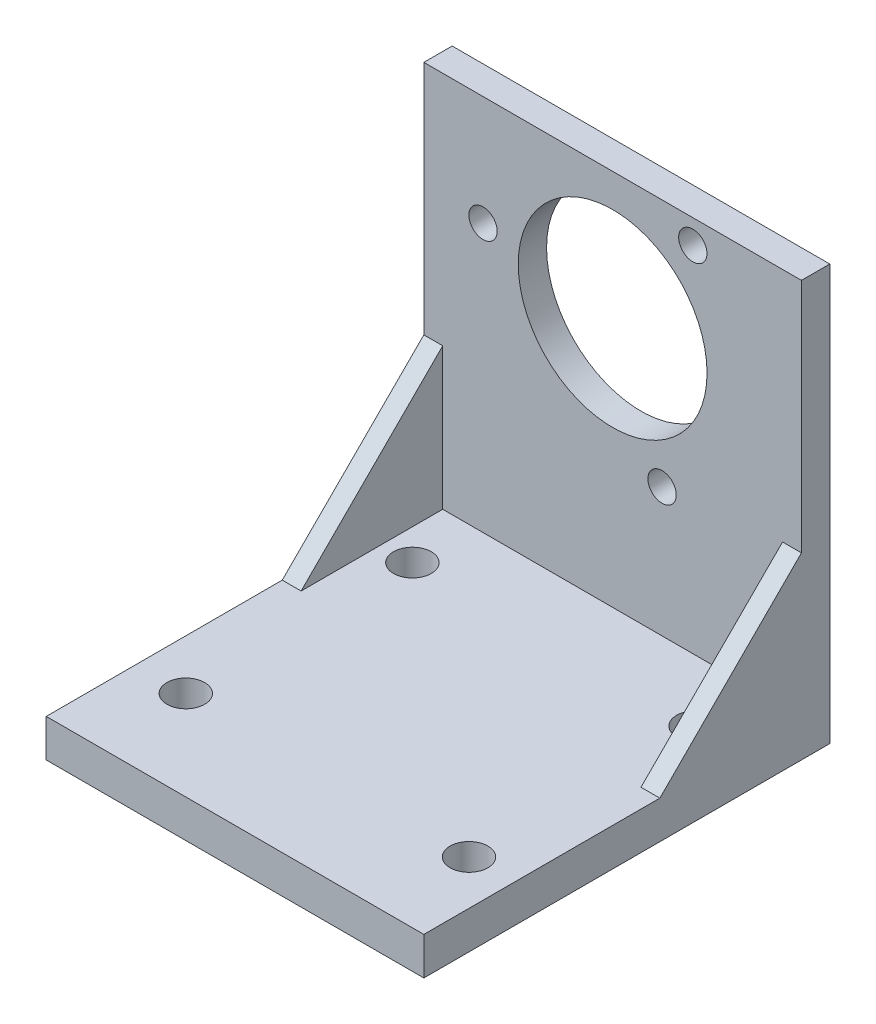
ISO-10303-21;
HEADER;
FILE_DESCRIPTION(('STEP AP214'),'2;1');
FILE_NAME('part.step','',(''),(''),'','','');
FILE_SCHEMA(('AUTOMOTIVE_DESIGN { 1 0 10303 214 1 1 1 1 }'));
ENDSEC;
DATA;
#1=APPLICATION_CONTEXT('core data for automotive mechanical design processes');
#2=APPLICATION_PROTOCOL_DEFINITION('international standard','automotive_design',2000,#1);
#3=PRODUCT_CONTEXT('',#1,'mechanical');
#4=PRODUCT('Part','Part','',(#3));
#5=PRODUCT_RELATED_PRODUCT_CATEGORY('part','',(#4));
#6=PRODUCT_DEFINITION_FORMATION('','',#4);
#7=PRODUCT_DEFINITION_CONTEXT('part definition',#1,'design');
#8=PRODUCT_DEFINITION('design','',#6,#7);
#9=PRODUCT_DEFINITION_SHAPE('','',#8);
#10=(LENGTH_UNIT() NAMED_UNIT(*) SI_UNIT(.MILLI.,.METRE.));
#11=(NAMED_UNIT(*) PLANE_ANGLE_UNIT() SI_UNIT($,.RADIAN.));
#12=(NAMED_UNIT(*) SI_UNIT($,.STERADIAN.) SOLID_ANGLE_UNIT());
#13=UNCERTAINTY_MEASURE_WITH_UNIT(LENGTH_MEASURE(1.E-05),#10,'distance_accuracy_value','');
#14=(GEOMETRIC_REPRESENTATION_CONTEXT(3) GLOBAL_UNCERTAINTY_ASSIGNED_CONTEXT((#13)) GLOBAL_UNIT_ASSIGNED_CONTEXT((#10,
#11,#12)) REPRESENTATION_CONTEXT('',''));
#15=CARTESIAN_POINT('',(0.,0.,0.));
#16=DIRECTION('',(0.,0.,1.));
#17=DIRECTION('',(1.,0.,0.));
#18=AXIS2_PLACEMENT_3D('',#15,#16,#17);
#19=CARTESIAN_POINT('',(0.,-4.,21.5));
#20=DIRECTION('',(0.,0.,1.));
#21=DIRECTION('',(1.,0.,0.));
#22=AXIS2_PLACEMENT_3D('',#19,#20,#21);
#23=PLANE('',#22);
#24=DIRECTION('',(1.,0.,0.));
#25=VECTOR('',#24,1.);
#26=CARTESIAN_POINT('',(0.,0.,21.5));
#27=LINE('',#26,#25);
#28=CARTESIAN_POINT('',(-20.,0.,21.5));
#29=VERTEX_POINT('',#28);
#30=CARTESIAN_POINT('',(20.,0.,21.5));
#31=VERTEX_POINT('',#30);
#32=EDGE_CURVE('E234',#29,#31,#27,.T.);
#33=ORIENTED_EDGE('',*,*,#32,.F.);
#34=DIRECTION('',(0.,1.,0.));
#35=VECTOR('',#34,1.);
#36=CARTESIAN_POINT('',(-20.,-4.,21.5));
#37=LINE('',#36,#35);
#38=CARTESIAN_POINT('',(-20.,-4.,21.5));
#39=VERTEX_POINT('',#38);
#40=EDGE_CURVE('E12',#39,#29,#37,.T.);
#41=ORIENTED_EDGE('',*,*,#40,.F.);
#42=DIRECTION('',(1.,0.,0.));
#43=VECTOR('',#42,1.);
#44=CARTESIAN_POINT('',(0.,-4.,21.5));
#45=LINE('',#44,#43);
#46=CARTESIAN_POINT('',(20.,-4.,21.5));
#47=VERTEX_POINT('',#46);
#48=EDGE_CURVE('E212',#39,#47,#45,.T.);
#49=ORIENTED_EDGE('',*,*,#48,.T.);
#50=DIRECTION('',(0.,1.,0.));
#51=VECTOR('',#50,1.);
#52=CARTESIAN_POINT('',(20.,-4.,21.5));
#53=LINE('',#52,#51);
#54=EDGE_CURVE('E54',#47,#31,#53,.T.);
#55=ORIENTED_EDGE('',*,*,#54,.T.);
#56=EDGE_LOOP('',(#33,#41,#49,#55));
#57=FACE_BOUND('',#56,.T.);
#58=ADVANCED_FACE('F50',(#57),#23,.T.);
#59=CARTESIAN_POINT('',(-20.,-4.,0.));
#60=DIRECTION('',(1.,0.,0.));
#61=DIRECTION('',(0.,0.,-1.));
#62=AXIS2_PLACEMENT_3D('',#59,#60,#61);
#63=PLANE('',#62);
#64=DIRECTION('',(0.,0.,-1.));
#65=VECTOR('',#64,1.);
#66=CARTESIAN_POINT('',(-20.,0.,0.));
#67=LINE('',#66,#65);
#68=CARTESIAN_POINT('',(-20.,0.,-3.5));
#69=VERTEX_POINT('',#68);
#70=EDGE_CURVE('E203',#29,#69,#67,.T.);
#71=ORIENTED_EDGE('',*,*,#70,.T.);
#72=DIRECTION('',(0.,0.707106781186547,-0.707106781186547));
#73=VECTOR('',#72,1.);
#74=CARTESIAN_POINT('',(-20.,15.,-18.5));
#75=LINE('',#74,#73);
#76=CARTESIAN_POINT('',(-20.,15.,-18.5));
#77=VERTEX_POINT('',#76);
#78=EDGE_CURVE('E258',#69,#77,#75,.T.);
#79=ORIENTED_EDGE('',*,*,#78,.T.);
#80=DIRECTION('',(0.,-1.,0.));
#81=VECTOR('',#80,1.);
#82=CARTESIAN_POINT('',(-20.,40.,-18.5));
#83=LINE('',#82,#81);
#84=CARTESIAN_POINT('',(-20.,40.,-18.5));
#85=VERTEX_POINT('',#84);
#86=EDGE_CURVE('E196',#85,#77,#83,.T.);
#87=ORIENTED_EDGE('',*,*,#86,.F.);
#88=DIRECTION('',(0.,0.,1.));
#89=VECTOR('',#88,1.);
#90=CARTESIAN_POINT('',(-20.,40.,0.));
#91=LINE('',#90,#89);
#92=CARTESIAN_POINT('',(-20.,40.,-21.5));
#93=VERTEX_POINT('',#92);
#94=EDGE_CURVE('E182',#93,#85,#91,.T.);
#95=ORIENTED_EDGE('',*,*,#94,.F.);
#96=DIRECTION('',(0.,1.,0.));
#97=VECTOR('',#96,1.);
#98=CARTESIAN_POINT('',(-20.,-4.,-21.5));
#99=LINE('',#98,#97);
#100=CARTESIAN_POINT('',(-20.,-4.,-21.5));
#101=VERTEX_POINT('',#100);
#102=EDGE_CURVE('E59',#101,#93,#99,.T.);
#103=ORIENTED_EDGE('',*,*,#102,.F.);
#104=DIRECTION('',(0.,0.,-1.));
#105=VECTOR('',#104,1.);
#106=CARTESIAN_POINT('',(-20.,-4.,0.));
#107=LINE('',#106,#105);
#108=EDGE_CURVE('E220',#39,#101,#107,.T.);
#109=ORIENTED_EDGE('',*,*,#108,.F.);
#110=ORIENTED_EDGE('',*,*,#40,.T.);
#111=EDGE_LOOP('',(#71,#79,#87,#95,#103,#109,#110));
#112=FACE_BOUND('',#111,.T.);
#113=ADVANCED_FACE('F256',(#112),#63,.F.);
#114=CARTESIAN_POINT('',(0.,-4.,-21.5));
#115=DIRECTION('',(0.,0.,1.));
#116=DIRECTION('',(1.,0.,0.));
#117=AXIS2_PLACEMENT_3D('',#114,#115,#116);
#118=PLANE('',#117);
#119=CARTESIAN_POINT('',(5.23636965743753,13.671109447397,-21.5));
#120=DIRECTION('',(0.,0.,1.));
#121=DIRECTION('',(1.,0.,0.));
#122=AXIS2_PLACEMENT_3D('',#119,#120,#121);
#123=CIRCLE('',#122,1.5);
#124=CARTESIAN_POINT('',(6.73636965743753,13.671109447397,-21.5));
#125=VERTEX_POINT('',#124);
#126=EDGE_CURVE('E179',#125,#125,#123,.T.);
#127=ORIENTED_EDGE('',*,*,#126,.T.);
#128=EDGE_LOOP('',(#127));
#129=FACE_BOUND('',#128,.T.);
#130=CARTESIAN_POINT('',(8.49196029220565,37.4492744232484,-21.5));
#131=DIRECTION('',(0.,0.,1.));
#132=DIRECTION('',(1.,0.,0.));
#133=AXIS2_PLACEMENT_3D('',#130,#131,#132);
#134=CIRCLE('',#133,1.5);
#135=CARTESIAN_POINT('',(9.99196029220565,37.4492744232484,-21.5));
#136=VERTEX_POINT('',#135);
#137=EDGE_CURVE('E176',#136,#136,#134,.T.);
#138=ORIENTED_EDGE('',*,*,#137,.T.);
#139=EDGE_LOOP('',(#138));
#140=FACE_BOUND('',#139,.T.);
#141=CARTESIAN_POINT('',(-13.7283299496432,28.3796161293546,-21.5));
#142=DIRECTION('',(0.,0.,1.));
#143=DIRECTION('',(1.,0.,0.));
#144=AXIS2_PLACEMENT_3D('',#141,#142,#143);
#145=CIRCLE('',#144,1.5);
#146=CARTESIAN_POINT('',(-12.2283299496432,28.3796161293546,-21.5));
#147=VERTEX_POINT('',#146);
#148=EDGE_CURVE('E173',#147,#147,#145,.T.);
#149=ORIENTED_EDGE('',*,*,#148,.T.);
#150=EDGE_LOOP('',(#149));
#151=FACE_BOUND('',#150,.T.);
#152=CARTESIAN_POINT('',(0.,26.5,-21.5));
#153=DIRECTION('',(0.,0.,1.));
#154=DIRECTION('',(1.,0.,0.));
#155=AXIS2_PLACEMENT_3D('',#152,#153,#154);
#156=CIRCLE('',#155,10.);
#157=CARTESIAN_POINT('',(10.,26.5,-21.5));
#158=VERTEX_POINT('',#157);
#159=EDGE_CURVE('E170',#158,#158,#156,.T.);
#160=ORIENTED_EDGE('',*,*,#159,.T.);
#161=EDGE_LOOP('',(#160));
#162=FACE_BOUND('',#161,.T.);
#163=ORIENTED_EDGE('',*,*,#102,.T.);
#164=DIRECTION('',(-1.,0.,0.));
#165=VECTOR('',#164,1.);
#166=CARTESIAN_POINT('',(0.,40.,-21.5));
#167=LINE('',#166,#165);
#168=CARTESIAN_POINT('',(20.,40.,-21.5));
#169=VERTEX_POINT('',#168);
#170=EDGE_CURVE('E190',#169,#93,#167,.T.);
#171=ORIENTED_EDGE('',*,*,#170,.F.);
#172=DIRECTION('',(0.,1.,0.));
#173=VECTOR('',#172,1.);
#174=CARTESIAN_POINT('',(20.,-4.,-21.5));
#175=LINE('',#174,#173);
#176=CARTESIAN_POINT('',(20.,-4.,-21.5));
#177=VERTEX_POINT('',#176);
#178=EDGE_CURVE('E241',#177,#169,#175,.T.);
#179=ORIENTED_EDGE('',*,*,#178,.F.);
#180=DIRECTION('',(1.,0.,0.));
#181=VECTOR('',#180,1.);
#182=CARTESIAN_POINT('',(0.,-4.,-21.5));
#183=LINE('',#182,#181);
#184=EDGE_CURVE('E218',#101,#177,#183,.T.);
#185=ORIENTED_EDGE('',*,*,#184,.F.);
#186=EDGE_LOOP('',(#163,#171,#179,#185));
#187=FACE_BOUND('',#186,.T.);
#188=ADVANCED_FACE('F280',(#129,#140,#151,#162,#187),#118,.F.);
#189=CARTESIAN_POINT('',(-14.7150530034863,-4.,-12.));
#190=DIRECTION('',(0.,1.,0.));
#191=DIRECTION('',(0.,0.,1.));
#192=AXIS2_PLACEMENT_3D('',#189,#190,#191);
#193=CYLINDRICAL_SURFACE('',#192,2.);
#194=CARTESIAN_POINT('',(-14.7150530034863,-4.,-12.));
#195=DIRECTION('',(0.,1.,0.));
#196=DIRECTION('',(0.,0.,1.));
#197=AXIS2_PLACEMENT_3D('',#194,#195,#196);
#198=CIRCLE('',#197,2.);
#199=CARTESIAN_POINT('',(-14.7150530034863,-4.,-10.));
#200=VERTEX_POINT('',#199);
#201=EDGE_CURVE('E209',#200,#200,#198,.T.);
#202=ORIENTED_EDGE('',*,*,#201,.F.);
#203=EDGE_LOOP('',(#202));
#204=FACE_BOUND('',#203,.T.);
#205=CARTESIAN_POINT('',(-14.7150530034863,0.,-12.));
#206=DIRECTION('',(0.,1.,0.));
#207=DIRECTION('',(0.,0.,1.));
#208=AXIS2_PLACEMENT_3D('',#205,#206,#207);
#209=CIRCLE('',#208,2.);
#210=CARTESIAN_POINT('',(-14.7150530034863,0.,-10.));
#211=VERTEX_POINT('',#210);
#212=EDGE_CURVE('E231',#211,#211,#209,.T.);
#213=ORIENTED_EDGE('',*,*,#212,.T.);
#214=EDGE_LOOP('',(#213));
#215=FACE_BOUND('',#214,.T.);
#216=ADVANCED_FACE('F302',(#204,#215),#193,.F.);
#217=CARTESIAN_POINT('',(15.2849469965137,-4.,-12.));
#218=DIRECTION('',(0.,1.,0.));
#219=DIRECTION('',(0.,0.,1.));
#220=AXIS2_PLACEMENT_3D('',#217,#218,#219);
#221=CYLINDRICAL_SURFACE('',#220,2.);
#222=CARTESIAN_POINT('',(15.2849469965137,-4.,-12.));
#223=DIRECTION('',(0.,1.,0.));
#224=DIRECTION('',(0.,0.,1.));
#225=AXIS2_PLACEMENT_3D('',#222,#223,#224);
#226=CIRCLE('',#225,2.);
#227=CARTESIAN_POINT('',(15.2849469965137,-4.,-9.99999999999999));
#228=VERTEX_POINT('',#227);
#229=EDGE_CURVE('E206',#228,#228,#226,.T.);
#230=ORIENTED_EDGE('',*,*,#229,.F.);
#231=EDGE_LOOP('',(#230));
#232=FACE_BOUND('',#231,.T.);
#233=CARTESIAN_POINT('',(15.2849469965137,0.,-12.));
#234=DIRECTION('',(0.,1.,0.));
#235=DIRECTION('',(0.,0.,1.));
#236=AXIS2_PLACEMENT_3D('',#233,#234,#235);
#237=CIRCLE('',#236,2.);
#238=CARTESIAN_POINT('',(15.2849469965137,0.,-9.99999999999999));
#239=VERTEX_POINT('',#238);
#240=EDGE_CURVE('E228',#239,#239,#237,.T.);
#241=ORIENTED_EDGE('',*,*,#240,.T.);
#242=EDGE_LOOP('',(#241));
#243=FACE_BOUND('',#242,.T.);
#244=ADVANCED_FACE('F305',(#232,#243),#221,.F.);
#245=CARTESIAN_POINT('',(-14.7150530034863,-4.,12.));
#246=DIRECTION('',(0.,1.,0.));
#247=DIRECTION('',(0.,0.,1.));
#248=AXIS2_PLACEMENT_3D('',#245,#246,#247);
#249=CYLINDRICAL_SURFACE('',#248,2.);
#250=CARTESIAN_POINT('',(-14.7150530034863,-4.,12.));
#251=DIRECTION('',(0.,1.,0.));
#252=DIRECTION('',(0.,0.,1.));
#253=AXIS2_PLACEMENT_3D('',#250,#251,#252);
#254=CIRCLE('',#253,2.);
#255=CARTESIAN_POINT('',(-14.7150530034863,-4.,14.));
#256=VERTEX_POINT('',#255);
#257=EDGE_CURVE('E202',#256,#256,#254,.T.);
#258=ORIENTED_EDGE('',*,*,#257,.F.);
#259=EDGE_LOOP('',(#258));
#260=FACE_BOUND('',#259,.T.);
#261=CARTESIAN_POINT('',(-14.7150530034863,0.,12.));
#262=DIRECTION('',(0.,1.,0.));
#263=DIRECTION('',(0.,0.,1.));
#264=AXIS2_PLACEMENT_3D('',#261,#262,#263);
#265=CIRCLE('',#264,2.);
#266=CARTESIAN_POINT('',(-14.7150530034863,0.,14.));
#267=VERTEX_POINT('',#266);
#268=EDGE_CURVE('E225',#267,#267,#265,.T.);
#269=ORIENTED_EDGE('',*,*,#268,.T.);
#270=EDGE_LOOP('',(#269));
#271=FACE_BOUND('',#270,.T.);
#272=ADVANCED_FACE('F308',(#260,#271),#249,.F.);
#273=CARTESIAN_POINT('',(15.2849469965137,-4.,12.));
#274=DIRECTION('',(0.,1.,0.));
#275=DIRECTION('',(0.,0.,1.));
#276=AXIS2_PLACEMENT_3D('',#273,#274,#275);
#277=CYLINDRICAL_SURFACE('',#276,2.);
#278=CARTESIAN_POINT('',(15.2849469965137,-4.,12.));
#279=DIRECTION('',(0.,1.,0.));
#280=DIRECTION('',(0.,0.,1.));
#281=AXIS2_PLACEMENT_3D('',#278,#279,#280);
#282=CIRCLE('',#281,2.);
#283=CARTESIAN_POINT('',(15.2849469965137,-4.,14.));
#284=VERTEX_POINT('',#283);
#285=EDGE_CURVE('E199',#284,#284,#282,.T.);
#286=ORIENTED_EDGE('',*,*,#285,.F.);
#287=EDGE_LOOP('',(#286));
#288=FACE_BOUND('',#287,.T.);
#289=CARTESIAN_POINT('',(15.2849469965137,0.,12.));
#290=DIRECTION('',(0.,1.,0.));
#291=DIRECTION('',(0.,0.,1.));
#292=AXIS2_PLACEMENT_3D('',#289,#290,#291);
#293=CIRCLE('',#292,2.);
#294=CARTESIAN_POINT('',(15.2849469965137,0.,14.));
#295=VERTEX_POINT('',#294);
#296=EDGE_CURVE('E198',#295,#295,#293,.T.);
#297=ORIENTED_EDGE('',*,*,#296,.T.);
#298=EDGE_LOOP('',(#297));
#299=FACE_BOUND('',#298,.T.);
#300=ADVANCED_FACE('F52',(#288,#299),#277,.F.);
#301=CARTESIAN_POINT('',(20.,-4.,0.));
#302=DIRECTION('',(1.,0.,0.));
#303=DIRECTION('',(0.,0.,-1.));
#304=AXIS2_PLACEMENT_3D('',#301,#302,#303);
#305=PLANE('',#304);
#306=DIRECTION('',(0.,0.,-1.));
#307=VECTOR('',#306,1.);
#308=CARTESIAN_POINT('',(20.,0.,0.));
#309=LINE('',#308,#307);
#310=CARTESIAN_POINT('',(20.,0.,-3.5));
#311=VERTEX_POINT('',#310);
#312=EDGE_CURVE('E237',#31,#311,#309,.T.);
#313=ORIENTED_EDGE('',*,*,#312,.F.);
#314=ORIENTED_EDGE('',*,*,#54,.F.);
#315=DIRECTION('',(0.,0.,-1.));
#316=VECTOR('',#315,1.);
#317=CARTESIAN_POINT('',(20.,-4.,0.));
#318=LINE('',#317,#316);
#319=EDGE_CURVE('E215',#47,#177,#318,.T.);
#320=ORIENTED_EDGE('',*,*,#319,.T.);
#321=ORIENTED_EDGE('',*,*,#178,.T.);
#322=DIRECTION('',(0.,0.,-1.));
#323=VECTOR('',#322,1.);
#324=CARTESIAN_POINT('',(20.,40.,0.));
#325=LINE('',#324,#323);
#326=CARTESIAN_POINT('',(20.,40.,-18.5));
#327=VERTEX_POINT('',#326);
#328=EDGE_CURVE('E187',#327,#169,#325,.T.);
#329=ORIENTED_EDGE('',*,*,#328,.F.);
#330=DIRECTION('',(0.,-1.,0.));
#331=VECTOR('',#330,1.);
#332=CARTESIAN_POINT('',(20.,40.,-18.5));
#333=LINE('',#332,#331);
#334=CARTESIAN_POINT('',(20.,15.,-18.5));
#335=VERTEX_POINT('',#334);
#336=EDGE_CURVE('E193',#327,#335,#333,.T.);
#337=ORIENTED_EDGE('',*,*,#336,.T.);
#338=DIRECTION('',(0.,-0.707106781186547,0.707106781186547));
#339=VECTOR('',#338,1.);
#340=CARTESIAN_POINT('',(20.,15.,-18.5));
#341=LINE('',#340,#339);
#342=EDGE_CURVE('E133',#335,#311,#341,.T.);
#343=ORIENTED_EDGE('',*,*,#342,.T.);
#344=EDGE_LOOP('',(#313,#314,#320,#321,#329,#337,#343));
#345=FACE_BOUND('',#344,.T.);
#346=ADVANCED_FACE('F250',(#345),#305,.T.);
#347=CARTESIAN_POINT('',(0.,-4.,0.));
#348=DIRECTION('',(0.,1.,0.));
#349=DIRECTION('',(0.,0.,1.));
#350=AXIS2_PLACEMENT_3D('',#347,#348,#349);
#351=PLANE('',#350);
#352=ORIENTED_EDGE('',*,*,#285,.T.);
#353=EDGE_LOOP('',(#352));
#354=FACE_BOUND('',#353,.T.);
#355=ORIENTED_EDGE('',*,*,#257,.T.);
#356=EDGE_LOOP('',(#355));
#357=FACE_BOUND('',#356,.T.);
#358=ORIENTED_EDGE('',*,*,#229,.T.);
#359=EDGE_LOOP('',(#358));
#360=FACE_BOUND('',#359,.T.);
#361=ORIENTED_EDGE('',*,*,#201,.T.);
#362=EDGE_LOOP('',(#361));
#363=FACE_BOUND('',#362,.T.);
#364=ORIENTED_EDGE('',*,*,#48,.F.);
#365=ORIENTED_EDGE('',*,*,#108,.T.);
#366=ORIENTED_EDGE('',*,*,#184,.T.);
#367=ORIENTED_EDGE('',*,*,#319,.F.);
#368=EDGE_LOOP('',(#364,#365,#366,#367));
#369=FACE_BOUND('',#368,.T.);
#370=ADVANCED_FACE('F282',(#354,#357,#360,#363,#369),#351,.F.);
#371=CARTESIAN_POINT('',(0.,0.,0.));
#372=DIRECTION('',(0.,1.,0.));
#373=DIRECTION('',(0.,0.,1.));
#374=AXIS2_PLACEMENT_3D('',#371,#372,#373);
#375=PLANE('',#374);
#376=DIRECTION('',(-1.,0.,0.));
#377=VECTOR('',#376,1.);
#378=CARTESIAN_POINT('',(-18.,0.,-3.5));
#379=LINE('',#378,#377);
#380=CARTESIAN_POINT('',(-18.,0.,-3.5));
#381=VERTEX_POINT('',#380);
#382=EDGE_CURVE('E71',#381,#69,#379,.T.);
#383=ORIENTED_EDGE('',*,*,#382,.T.);
#384=ORIENTED_EDGE('',*,*,#70,.F.);
#385=ORIENTED_EDGE('',*,*,#32,.T.);
#386=ORIENTED_EDGE('',*,*,#312,.T.);
#387=DIRECTION('',(1.,0.,0.));
#388=VECTOR('',#387,1.);
#389=CARTESIAN_POINT('',(18.,0.,-3.5));
#390=LINE('',#389,#388);
#391=CARTESIAN_POINT('',(18.,0.,-3.5));
#392=VERTEX_POINT('',#391);
#393=EDGE_CURVE('E138',#392,#311,#390,.T.);
#394=ORIENTED_EDGE('',*,*,#393,.F.);
#395=DIRECTION('',(0.,0.,-1.));
#396=VECTOR('',#395,1.);
#397=CARTESIAN_POINT('',(18.,0.,-3.5));
#398=LINE('',#397,#396);
#399=CARTESIAN_POINT('',(18.,0.,-18.5));
#400=VERTEX_POINT('',#399);
#401=EDGE_CURVE('E139',#392,#400,#398,.T.);
#402=ORIENTED_EDGE('',*,*,#401,.T.);
#403=DIRECTION('',(1.,0.,0.));
#404=VECTOR('',#403,1.);
#405=CARTESIAN_POINT('',(0.,0.,-18.5));
#406=LINE('',#405,#404);
#407=CARTESIAN_POINT('',(-18.,0.,-18.5));
#408=VERTEX_POINT('',#407);
#409=EDGE_CURVE('E149',#408,#400,#406,.T.);
#410=ORIENTED_EDGE('',*,*,#409,.F.);
#411=DIRECTION('',(0.,0.,1.));
#412=VECTOR('',#411,1.);
#413=CARTESIAN_POINT('',(-18.,0.,-3.5));
#414=LINE('',#413,#412);
#415=EDGE_CURVE('E67',#408,#381,#414,.T.);
#416=ORIENTED_EDGE('',*,*,#415,.T.);
#417=EDGE_LOOP('',(#383,#384,#385,#386,#394,#402,#410,#416));
#418=FACE_BOUND('',#417,.T.);
#419=ORIENTED_EDGE('',*,*,#296,.F.);
#420=EDGE_LOOP('',(#419));
#421=FACE_BOUND('',#420,.T.);
#422=ORIENTED_EDGE('',*,*,#268,.F.);
#423=EDGE_LOOP('',(#422));
#424=FACE_BOUND('',#423,.T.);
#425=ORIENTED_EDGE('',*,*,#240,.F.);
#426=EDGE_LOOP('',(#425));
#427=FACE_BOUND('',#426,.T.);
#428=ORIENTED_EDGE('',*,*,#212,.F.);
#429=EDGE_LOOP('',(#428));
#430=FACE_BOUND('',#429,.T.);
#431=ADVANCED_FACE('F251',(#418,#421,#424,#427,#430),#375,.T.);
#432=CARTESIAN_POINT('',(0.,40.,-18.5));
#433=DIRECTION('',(0.,0.,-1.));
#434=DIRECTION('',(-1.,0.,0.));
#435=AXIS2_PLACEMENT_3D('',#432,#433,#434);
#436=PLANE('',#435);
#437=CARTESIAN_POINT('',(5.23636965743753,13.671109447397,-18.5));
#438=DIRECTION('',(0.,0.,1.));
#439=DIRECTION('',(1.,0.,0.));
#440=AXIS2_PLACEMENT_3D('',#437,#438,#439);
#441=CIRCLE('',#440,1.5);
#442=CARTESIAN_POINT('',(6.73636965743753,13.671109447397,-18.5));
#443=VERTEX_POINT('',#442);
#444=EDGE_CURVE('E157',#443,#443,#441,.T.);
#445=ORIENTED_EDGE('',*,*,#444,.F.);
#446=EDGE_LOOP('',(#445));
#447=FACE_BOUND('',#446,.T.);
#448=CARTESIAN_POINT('',(8.49196029220565,37.4492744232484,-18.5));
#449=DIRECTION('',(0.,0.,1.));
#450=DIRECTION('',(1.,0.,0.));
#451=AXIS2_PLACEMENT_3D('',#448,#449,#450);
#452=CIRCLE('',#451,1.5);
#453=CARTESIAN_POINT('',(9.99196029220565,37.4492744232484,-18.5));
#454=VERTEX_POINT('',#453);
#455=EDGE_CURVE('E163',#454,#454,#452,.T.);
#456=ORIENTED_EDGE('',*,*,#455,.F.);
#457=EDGE_LOOP('',(#456));
#458=FACE_BOUND('',#457,.T.);
#459=CARTESIAN_POINT('',(-13.7283299496432,28.3796161293546,-18.5));
#460=DIRECTION('',(0.,0.,1.));
#461=DIRECTION('',(1.,0.,0.));
#462=AXIS2_PLACEMENT_3D('',#459,#460,#461);
#463=CIRCLE('',#462,1.5);
#464=CARTESIAN_POINT('',(-12.2283299496432,28.3796161293546,-18.5));
#465=VERTEX_POINT('',#464);
#466=EDGE_CURVE('E159',#465,#465,#463,.T.);
#467=ORIENTED_EDGE('',*,*,#466,.F.);
#468=EDGE_LOOP('',(#467));
#469=FACE_BOUND('',#468,.T.);
#470=CARTESIAN_POINT('',(0.,26.5,-18.5));
#471=DIRECTION('',(0.,0.,1.));
#472=DIRECTION('',(1.,0.,0.));
#473=AXIS2_PLACEMENT_3D('',#470,#471,#472);
#474=CIRCLE('',#473,10.);
#475=CARTESIAN_POINT('',(10.,26.5,-18.5));
#476=VERTEX_POINT('',#475);
#477=EDGE_CURVE('E162',#476,#476,#474,.T.);
#478=ORIENTED_EDGE('',*,*,#477,.F.);
#479=EDGE_LOOP('',(#478));
#480=FACE_BOUND('',#479,.T.);
#481=ORIENTED_EDGE('',*,*,#86,.T.);
#482=DIRECTION('',(-1.,0.,0.));
#483=VECTOR('',#482,1.);
#484=CARTESIAN_POINT('',(-18.,15.,-18.5));
#485=LINE('',#484,#483);
#486=CARTESIAN_POINT('',(-18.,15.,-18.5));
#487=VERTEX_POINT('',#486);
#488=EDGE_CURVE('E151',#487,#77,#485,.T.);
#489=ORIENTED_EDGE('',*,*,#488,.F.);
#490=DIRECTION('',(0.,-1.,0.));
#491=VECTOR('',#490,1.);
#492=CARTESIAN_POINT('',(-18.,0.,-18.5));
#493=LINE('',#492,#491);
#494=EDGE_CURVE('E265',#487,#408,#493,.T.);
#495=ORIENTED_EDGE('',*,*,#494,.T.);
#496=ORIENTED_EDGE('',*,*,#409,.T.);
#497=DIRECTION('',(0.,1.,0.));
#498=VECTOR('',#497,1.);
#499=CARTESIAN_POINT('',(18.,0.,-18.5));
#500=LINE('',#499,#498);
#501=CARTESIAN_POINT('',(18.,15.,-18.5));
#502=VERTEX_POINT('',#501);
#503=EDGE_CURVE('E144',#400,#502,#500,.T.);
#504=ORIENTED_EDGE('',*,*,#503,.T.);
#505=DIRECTION('',(1.,0.,0.));
#506=VECTOR('',#505,1.);
#507=CARTESIAN_POINT('',(18.,15.,-18.5));
#508=LINE('',#507,#506);
#509=EDGE_CURVE('E127',#502,#335,#508,.T.);
#510=ORIENTED_EDGE('',*,*,#509,.T.);
#511=ORIENTED_EDGE('',*,*,#336,.F.);
#512=DIRECTION('',(1.,0.,0.));
#513=VECTOR('',#512,1.);
#514=CARTESIAN_POINT('',(0.,40.,-18.5));
#515=LINE('',#514,#513);
#516=EDGE_CURVE('E185',#85,#327,#515,.T.);
#517=ORIENTED_EDGE('',*,*,#516,.F.);
#518=EDGE_LOOP('',(#481,#489,#495,#496,#504,#510,#511,#517));
#519=FACE_BOUND('',#518,.T.);
#520=ADVANCED_FACE('F148',(#447,#458,#469,#480,#519),#436,.F.);
#521=CARTESIAN_POINT('',(0.,40.,0.));
#522=DIRECTION('',(0.,1.,0.));
#523=DIRECTION('',(0.,0.,1.));
#524=AXIS2_PLACEMENT_3D('',#521,#522,#523);
#525=PLANE('',#524);
#526=ORIENTED_EDGE('',*,*,#94,.T.);
#527=ORIENTED_EDGE('',*,*,#516,.T.);
#528=ORIENTED_EDGE('',*,*,#328,.T.);
#529=ORIENTED_EDGE('',*,*,#170,.T.);
#530=EDGE_LOOP('',(#526,#527,#528,#529));
#531=FACE_BOUND('',#530,.T.);
#532=ADVANCED_FACE('F277',(#531),#525,.T.);
#533=CARTESIAN_POINT('',(0.,26.5,-42.5));
#534=DIRECTION('',(0.,0.,1.));
#535=DIRECTION('',(1.,0.,0.));
#536=AXIS2_PLACEMENT_3D('',#533,#534,#535);
#537=CYLINDRICAL_SURFACE('',#536,10.);
#538=ORIENTED_EDGE('',*,*,#477,.T.);
#539=EDGE_LOOP('',(#538));
#540=FACE_BOUND('',#539,.T.);
#541=ORIENTED_EDGE('',*,*,#159,.F.);
#542=EDGE_LOOP('',(#541));
#543=FACE_BOUND('',#542,.T.);
#544=ADVANCED_FACE('F413',(#540,#543),#537,.F.);
#545=CARTESIAN_POINT('',(-13.7283299496432,28.3796161293546,-42.5));
#546=DIRECTION('',(0.,0.,1.));
#547=DIRECTION('',(1.,0.,0.));
#548=AXIS2_PLACEMENT_3D('',#545,#546,#547);
#549=CYLINDRICAL_SURFACE('',#548,1.5);
#550=ORIENTED_EDGE('',*,*,#466,.T.);
#551=EDGE_LOOP('',(#550));
#552=FACE_BOUND('',#551,.T.);
#553=ORIENTED_EDGE('',*,*,#148,.F.);
#554=EDGE_LOOP('',(#553));
#555=FACE_BOUND('',#554,.T.);
#556=ADVANCED_FACE('F409',(#552,#555),#549,.F.);
#557=CARTESIAN_POINT('',(8.49196029220565,37.4492744232484,-42.5));
#558=DIRECTION('',(0.,0.,1.));
#559=DIRECTION('',(1.,0.,0.));
#560=AXIS2_PLACEMENT_3D('',#557,#558,#559);
#561=CYLINDRICAL_SURFACE('',#560,1.5);
#562=ORIENTED_EDGE('',*,*,#455,.T.);
#563=EDGE_LOOP('',(#562));
#564=FACE_BOUND('',#563,.T.);
#565=ORIENTED_EDGE('',*,*,#137,.F.);
#566=EDGE_LOOP('',(#565));
#567=FACE_BOUND('',#566,.T.);
#568=ADVANCED_FACE('F412',(#564,#567),#561,.F.);
#569=CARTESIAN_POINT('',(5.23636965743753,13.671109447397,-42.5));
#570=DIRECTION('',(0.,0.,1.));
#571=DIRECTION('',(1.,0.,0.));
#572=AXIS2_PLACEMENT_3D('',#569,#570,#571);
#573=CYLINDRICAL_SURFACE('',#572,1.5);
#574=ORIENTED_EDGE('',*,*,#444,.T.);
#575=EDGE_LOOP('',(#574));
#576=FACE_BOUND('',#575,.T.);
#577=ORIENTED_EDGE('',*,*,#126,.F.);
#578=EDGE_LOOP('',(#577));
#579=FACE_BOUND('',#578,.T.);
#580=ADVANCED_FACE('F348',(#576,#579),#573,.F.);
#581=CARTESIAN_POINT('',(18.,15.,-18.5));
#582=DIRECTION('',(0.,0.707106781186547,0.707106781186547));
#583=DIRECTION('',(0.,-0.707106781186548,0.707106781186548));
#584=AXIS2_PLACEMENT_3D('',#581,#582,#583);
#585=PLANE('',#584);
#586=ORIENTED_EDGE('',*,*,#342,.F.);
#587=ORIENTED_EDGE('',*,*,#509,.F.);
#588=DIRECTION('',(0.,-0.707106781186547,0.707106781186547));
#589=VECTOR('',#588,1.);
#590=CARTESIAN_POINT('',(18.,15.,-18.5));
#591=LINE('',#590,#589);
#592=EDGE_CURVE('E130',#502,#392,#591,.T.);
#593=ORIENTED_EDGE('',*,*,#592,.T.);
#594=ORIENTED_EDGE('',*,*,#393,.T.);
#595=EDGE_LOOP('',(#586,#587,#593,#594));
#596=FACE_BOUND('',#595,.T.);
#597=ADVANCED_FACE('F129',(#596),#585,.T.);
#598=CARTESIAN_POINT('',(18.,0.,0.));
#599=DIRECTION('',(-1.,0.,0.));
#600=DIRECTION('',(0.,0.,1.));
#601=AXIS2_PLACEMENT_3D('',#598,#599,#600);
#602=PLANE('',#601);
#603=ORIENTED_EDGE('',*,*,#503,.F.);
#604=ORIENTED_EDGE('',*,*,#401,.F.);
#605=ORIENTED_EDGE('',*,*,#592,.F.);
#606=EDGE_LOOP('',(#603,#604,#605));
#607=FACE_BOUND('',#606,.T.);
#608=ADVANCED_FACE('F143',(#607),#602,.T.);
#609=CARTESIAN_POINT('',(-18.,15.,-18.5));
#610=DIRECTION('',(0.,0.707106781186547,0.707106781186547));
#611=DIRECTION('',(0.,-0.707106781186548,0.707106781186548));
#612=AXIS2_PLACEMENT_3D('',#609,#610,#611);
#613=PLANE('',#612);
#614=ORIENTED_EDGE('',*,*,#78,.F.);
#615=ORIENTED_EDGE('',*,*,#382,.F.);
#616=DIRECTION('',(0.,0.707106781186547,-0.707106781186547));
#617=VECTOR('',#616,1.);
#618=CARTESIAN_POINT('',(-18.,15.,-18.5));
#619=LINE('',#618,#617);
#620=EDGE_CURVE('E269',#381,#487,#619,.T.);
#621=ORIENTED_EDGE('',*,*,#620,.T.);
#622=ORIENTED_EDGE('',*,*,#488,.T.);
#623=EDGE_LOOP('',(#614,#615,#621,#622));
#624=FACE_BOUND('',#623,.T.);
#625=ADVANCED_FACE('F262',(#624),#613,.T.);
#626=CARTESIAN_POINT('',(-18.,0.,0.));
#627=DIRECTION('',(-1.,0.,0.));
#628=DIRECTION('',(0.,0.,1.));
#629=AXIS2_PLACEMENT_3D('',#626,#627,#628);
#630=PLANE('',#629);
#631=ORIENTED_EDGE('',*,*,#494,.F.);
#632=ORIENTED_EDGE('',*,*,#620,.F.);
#633=ORIENTED_EDGE('',*,*,#415,.F.);
#634=EDGE_LOOP('',(#631,#632,#633));
#635=FACE_BOUND('',#634,.T.);
#636=ADVANCED_FACE('F273',(#635),#630,.F.);
#637=CLOSED_SHELL('',(#58,#113,#188,#216,#244,#272,#300,#346,#370,#431,#520,#532,#544,#556,#568,
#580,#597,#608,#625,#636));
#638=MANIFOLD_SOLID_BREP('B2',#637);
#639=ADVANCED_BREP_SHAPE_REPRESENTATION('',(#18,#638),#14);
#640=SHAPE_DEFINITION_REPRESENTATION(#9,#639);
ENDSEC;
END-ISO-10303-21;
